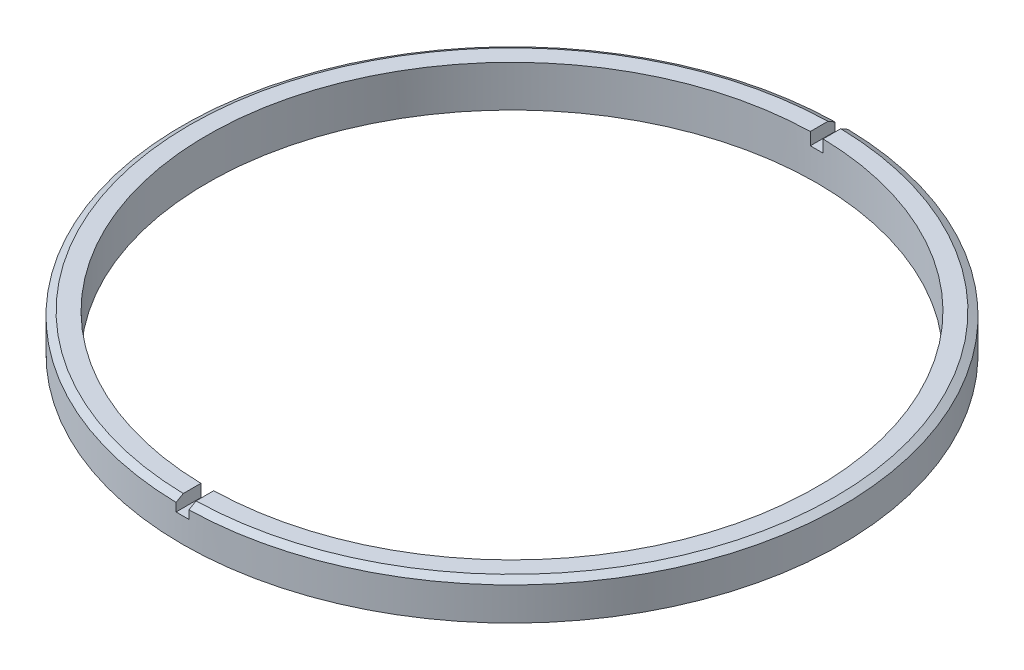
ISO-10303-21;
HEADER;
FILE_DESCRIPTION(('STEP AP214'),'2;1');
FILE_NAME('part.step','',(''),(''),'','','');
FILE_SCHEMA(('AUTOMOTIVE_DESIGN { 1 0 10303 214 1 1 1 1 }'));
ENDSEC;
DATA;
#1=APPLICATION_CONTEXT('core data for automotive mechanical design processes');
#2=APPLICATION_PROTOCOL_DEFINITION('international standard','automotive_design',2000,#1);
#3=PRODUCT_CONTEXT('',#1,'mechanical');
#4=PRODUCT('Part','Part','',(#3));
#5=PRODUCT_RELATED_PRODUCT_CATEGORY('part','',(#4));
#6=PRODUCT_DEFINITION_FORMATION('','',#4);
#7=PRODUCT_DEFINITION_CONTEXT('part definition',#1,'design');
#8=PRODUCT_DEFINITION('design','',#6,#7);
#9=PRODUCT_DEFINITION_SHAPE('','',#8);
#10=(LENGTH_UNIT() NAMED_UNIT(*) SI_UNIT(.MILLI.,.METRE.));
#11=(NAMED_UNIT(*) PLANE_ANGLE_UNIT() SI_UNIT($,.RADIAN.));
#12=(NAMED_UNIT(*) SI_UNIT($,.STERADIAN.) SOLID_ANGLE_UNIT());
#13=UNCERTAINTY_MEASURE_WITH_UNIT(LENGTH_MEASURE(1.E-05),#10,'distance_accuracy_value','');
#14=(GEOMETRIC_REPRESENTATION_CONTEXT(3) GLOBAL_UNCERTAINTY_ASSIGNED_CONTEXT((#13)) GLOBAL_UNIT_ASSIGNED_CONTEXT((#10,
#11,#12)) REPRESENTATION_CONTEXT('',''));
#15=CARTESIAN_POINT('',(0.,0.,0.));
#16=DIRECTION('',(0.,0.,1.));
#17=DIRECTION('',(1.,0.,0.));
#18=AXIS2_PLACEMENT_3D('',#15,#16,#17);
#19=CARTESIAN_POINT('',(0.,1.016,0.));
#20=DIRECTION('',(0.,-1.,0.));
#21=DIRECTION('',(0.,0.,-1.));
#22=AXIS2_PLACEMENT_3D('',#19,#20,#21);
#23=CONICAL_SURFACE('',#22,20.25,1.04719755119659);
#24=CARTESIAN_POINT('',(0.393700000000006,2.55381737891898,-17.582014814696));
#25=CARTESIAN_POINT('',(0.393700000000006,2.079299758821,-18.4041039172719));
#26=CARTESIAN_POINT('',(0.393700000000007,1.60477356976618,-19.2261880735266));
#27=CARTESIAN_POINT('',(0.393700000000007,0.655704053755512,-20.8703464933714));
#28=CARTESIAN_POINT('',(0.393700000000007,0.181160726799667,-21.6924207569616));
#29=CARTESIAN_POINT('',(0.393700000000007,-0.29339116911303,-22.5144900742305));
#30=B_SPLINE_CURVE_WITH_KNOTS('',3,(#24,#25,#26,#27,#28,#29),.UNSPECIFIED.,.F.,.F.,(4,2,4),(0.,
2.84762658657598,5.69525317307586),.UNSPECIFIED.);
#31=CARTESIAN_POINT('',(0.393700000000007,1.27,-19.8061465624321));
#32=VERTEX_POINT('',#31);
#33=CARTESIAN_POINT('',(0.393700000000007,1.016,-20.2461724854354));
#34=VERTEX_POINT('',#33);
#35=EDGE_CURVE('E128',#32,#34,#30,.T.);
#36=ORIENTED_EDGE('',*,*,#35,.F.);
#37=CARTESIAN_POINT('',(0.,1.27,0.));
#38=DIRECTION('',(0.,1.,0.));
#39=DIRECTION('',(0.,0.,1.));
#40=AXIS2_PLACEMENT_3D('',#37,#38,#39);
#41=CIRCLE('',#40,19.8100590948775);
#42=CARTESIAN_POINT('',(0.393700000000007,1.27,19.8061465624321));
#43=VERTEX_POINT('',#42);
#44=EDGE_CURVE('E10',#43,#32,#41,.T.);
#45=ORIENTED_EDGE('',*,*,#44,.F.);
#46=CARTESIAN_POINT('',(0.393700000000007,-0.128390531450435,22.2286563339852));
#47=CARTESIAN_POINT('',(0.393700000000007,0.346160065044203,21.4065862665888));
#48=CARTESIAN_POINT('',(0.393700000000007,0.820701711461422,20.5845110329041));
#49=CARTESIAN_POINT('',(0.393700000000006,1.76976710415505,18.9403502329336));
#50=CARTESIAN_POINT('',(0.393700000000006,2.24429085043146,18.1182646666479));
#51=CARTESIAN_POINT('',(0.393700000000006,2.71880564663046,17.2961739340739));
#52=B_SPLINE_CURVE_WITH_KNOTS('',3,(#46,#47,#48,#49,#50,#51),.UNSPECIFIED.,.F.,.F.,(4,2,4),(0.,
2.84762658651018,5.69525317310457),.UNSPECIFIED.);
#53=CARTESIAN_POINT('',(0.393700000000007,1.016,20.2461724854354));
#54=VERTEX_POINT('',#53);
#55=EDGE_CURVE('E161',#54,#43,#52,.T.);
#56=ORIENTED_EDGE('',*,*,#55,.F.);
#57=CARTESIAN_POINT('',(0.,1.016,0.));
#58=DIRECTION('',(0.,1.,0.));
#59=DIRECTION('',(0.,0.,1.));
#60=AXIS2_PLACEMENT_3D('',#57,#58,#59);
#61=CIRCLE('',#60,20.25);
#62=EDGE_CURVE('E169',#54,#34,#61,.T.);
#63=ORIENTED_EDGE('',*,*,#62,.T.);
#64=EDGE_LOOP('',(#36,#45,#56,#63));
#65=FACE_BOUND('',#64,.T.);
#66=ADVANCED_FACE('F16',(#65),#23,.T.);
#67=CARTESIAN_POINT('',(18.726,1.27,0.));
#68=DIRECTION('',(0.,-1.,0.));
#69=DIRECTION('',(0.,0.,-1.));
#70=AXIS2_PLACEMENT_3D('',#67,#68,#69);
#71=PLANE('',#70);
#72=DIRECTION('',(0.,0.,1.));
#73=VECTOR('',#72,1.);
#74=CARTESIAN_POINT('',(0.393700000000004,1.27,0.));
#75=LINE('',#74,#73);
#76=CARTESIAN_POINT('',(0.393700000000006,1.27,-18.7218609200581));
#77=VERTEX_POINT('',#76);
#78=EDGE_CURVE('E216',#32,#77,#75,.T.);
#79=ORIENTED_EDGE('',*,*,#78,.T.);
#80=CARTESIAN_POINT('',(0.,1.27,0.));
#81=DIRECTION('',(0.,1.,0.));
#82=DIRECTION('',(0.,0.,1.));
#83=AXIS2_PLACEMENT_3D('',#80,#81,#82);
#84=CIRCLE('',#83,18.726);
#85=CARTESIAN_POINT('',(0.393700000000006,1.27,18.7218609200581));
#86=VERTEX_POINT('',#85);
#87=EDGE_CURVE('E181',#86,#77,#84,.T.);
#88=ORIENTED_EDGE('',*,*,#87,.F.);
#89=DIRECTION('',(0.,0.,1.));
#90=VECTOR('',#89,1.);
#91=CARTESIAN_POINT('',(0.393700000000004,1.27,0.));
#92=LINE('',#91,#90);
#93=EDGE_CURVE('E203',#86,#43,#92,.T.);
#94=ORIENTED_EDGE('',*,*,#93,.T.);
#95=ORIENTED_EDGE('',*,*,#44,.T.);
#96=EDGE_LOOP('',(#79,#88,#94,#95));
#97=FACE_BOUND('',#96,.T.);
#98=ADVANCED_FACE('F224',(#97),#71,.F.);
#99=CARTESIAN_POINT('',(0.,1.27,0.));
#100=DIRECTION('',(0.,1.,0.));
#101=DIRECTION('',(0.,0.,1.));
#102=AXIS2_PLACEMENT_3D('',#99,#100,#101);
#103=CYLINDRICAL_SURFACE('',#102,18.726);
#104=CARTESIAN_POINT('',(0.,-1.27,0.));
#105=DIRECTION('',(0.,1.,0.));
#106=DIRECTION('',(0.,0.,1.));
#107=AXIS2_PLACEMENT_3D('',#104,#105,#106);
#108=CIRCLE('',#107,18.726);
#109=CARTESIAN_POINT('',(0.,-1.27,18.726));
#110=VERTEX_POINT('',#109);
#111=EDGE_CURVE('E178',#110,#110,#108,.T.);
#112=ORIENTED_EDGE('',*,*,#111,.F.);
#113=EDGE_LOOP('',(#112));
#114=FACE_BOUND('',#113,.T.);
#115=DIRECTION('',(0.,1.,0.));
#116=VECTOR('',#115,1.);
#117=CARTESIAN_POINT('',(0.393700000000006,0.508,-18.7218609200581));
#118=LINE('',#117,#116);
#119=CARTESIAN_POINT('',(0.393700000000006,0.508,-18.7218609200581));
#120=VERTEX_POINT('',#119);
#121=EDGE_CURVE('E117',#120,#77,#118,.T.);
#122=ORIENTED_EDGE('',*,*,#121,.F.);
#123=CARTESIAN_POINT('',(0.,0.508,0.));
#124=DIRECTION('',(0.,1.,0.));
#125=DIRECTION('',(0.,0.,1.));
#126=AXIS2_PLACEMENT_3D('',#123,#124,#125);
#127=CIRCLE('',#126,18.726);
#128=CARTESIAN_POINT('',(-0.393699999999994,0.508,-18.7218609200581));
#129=VERTEX_POINT('',#128);
#130=EDGE_CURVE('E103',#120,#129,#127,.T.);
#131=ORIENTED_EDGE('',*,*,#130,.T.);
#132=DIRECTION('',(0.,1.,0.));
#133=VECTOR('',#132,1.);
#134=CARTESIAN_POINT('',(-0.393699999999994,0.508,-18.7218609200581));
#135=LINE('',#134,#133);
#136=CARTESIAN_POINT('',(-0.393699999999994,1.27,-18.7218609200581));
#137=VERTEX_POINT('',#136);
#138=EDGE_CURVE('E101',#129,#137,#135,.T.);
#139=ORIENTED_EDGE('',*,*,#138,.T.);
#140=CARTESIAN_POINT('',(-0.393699999999994,1.27,18.7218609200581));
#141=VERTEX_POINT('',#140);
#142=EDGE_CURVE('E180',#137,#141,#84,.T.);
#143=ORIENTED_EDGE('',*,*,#142,.T.);
#144=DIRECTION('',(0.,1.,0.));
#145=VECTOR('',#144,1.);
#146=CARTESIAN_POINT('',(-0.393699999999994,0.508,18.7218609200581));
#147=LINE('',#146,#145);
#148=CARTESIAN_POINT('',(-0.393699999999994,0.508,18.7218609200581));
#149=VERTEX_POINT('',#148);
#150=EDGE_CURVE('E192',#149,#141,#147,.T.);
#151=ORIENTED_EDGE('',*,*,#150,.F.);
#152=CARTESIAN_POINT('',(0.,0.508,0.));
#153=DIRECTION('',(0.,1.,0.));
#154=DIRECTION('',(0.,0.,1.));
#155=AXIS2_PLACEMENT_3D('',#152,#153,#154);
#156=CIRCLE('',#155,18.726);
#157=CARTESIAN_POINT('',(0.393700000000006,0.508,18.7218609200581));
#158=VERTEX_POINT('',#157);
#159=EDGE_CURVE('E205',#149,#158,#156,.T.);
#160=ORIENTED_EDGE('',*,*,#159,.T.);
#161=DIRECTION('',(0.,1.,0.));
#162=VECTOR('',#161,1.);
#163=CARTESIAN_POINT('',(0.393700000000006,0.508,18.7218609200581));
#164=LINE('',#163,#162);
#165=EDGE_CURVE('E163',#158,#86,#164,.T.);
#166=ORIENTED_EDGE('',*,*,#165,.T.);
#167=ORIENTED_EDGE('',*,*,#87,.T.);
#168=EDGE_LOOP('',(#122,#131,#139,#143,#151,#160,#166,#167));
#169=FACE_BOUND('',#168,.T.);
#170=ADVANCED_FACE('F190',(#114,#169),#103,.F.);
#171=CARTESIAN_POINT('',(0.,1.27,0.));
#172=DIRECTION('',(0.,1.,0.));
#173=DIRECTION('',(0.,0.,1.));
#174=AXIS2_PLACEMENT_3D('',#171,#172,#173);
#175=CYLINDRICAL_SURFACE('',#174,20.25);
#176=CARTESIAN_POINT('',(0.,-1.016,0.));
#177=DIRECTION('',(0.,1.,0.));
#178=DIRECTION('',(0.,0.,1.));
#179=AXIS2_PLACEMENT_3D('',#176,#177,#178);
#180=CIRCLE('',#179,20.25);
#181=CARTESIAN_POINT('',(0.,-1.016,20.25));
#182=VERTEX_POINT('',#181);
#183=EDGE_CURVE('E172',#182,#182,#180,.T.);
#184=ORIENTED_EDGE('',*,*,#183,.T.);
#185=EDGE_LOOP('',(#184));
#186=FACE_BOUND('',#185,.T.);
#187=DIRECTION('',(0.,1.,0.));
#188=VECTOR('',#187,1.);
#189=CARTESIAN_POINT('',(0.393700000000007,0.508,-20.2461724854354));
#190=LINE('',#189,#188);
#191=CARTESIAN_POINT('',(0.393700000000007,0.508,-20.2461724854354));
#192=VERTEX_POINT('',#191);
#193=EDGE_CURVE('E115',#192,#34,#190,.T.);
#194=ORIENTED_EDGE('',*,*,#193,.T.);
#195=ORIENTED_EDGE('',*,*,#62,.F.);
#196=DIRECTION('',(0.,1.,0.));
#197=VECTOR('',#196,1.);
#198=CARTESIAN_POINT('',(0.393700000000007,0.508,20.2461724854354));
#199=LINE('',#198,#197);
#200=CARTESIAN_POINT('',(0.393700000000007,0.508,20.2461724854354));
#201=VERTEX_POINT('',#200);
#202=EDGE_CURVE('E162',#201,#54,#199,.T.);
#203=ORIENTED_EDGE('',*,*,#202,.F.);
#204=CARTESIAN_POINT('',(0.,0.508,0.));
#205=DIRECTION('',(0.,1.,0.));
#206=DIRECTION('',(0.,0.,1.));
#207=AXIS2_PLACEMENT_3D('',#204,#205,#206);
#208=CIRCLE('',#207,20.25);
#209=CARTESIAN_POINT('',(-0.393699999999994,0.508,20.2461724854354));
#210=VERTEX_POINT('',#209);
#211=EDGE_CURVE('E213',#210,#201,#208,.T.);
#212=ORIENTED_EDGE('',*,*,#211,.F.);
#213=DIRECTION('',(0.,1.,0.));
#214=VECTOR('',#213,1.);
#215=CARTESIAN_POINT('',(-0.393699999999994,0.508,20.2461724854354));
#216=LINE('',#215,#214);
#217=CARTESIAN_POINT('',(-0.393699999999994,1.016,20.2461724854354));
#218=VERTEX_POINT('',#217);
#219=EDGE_CURVE('E199',#210,#218,#216,.T.);
#220=ORIENTED_EDGE('',*,*,#219,.T.);
#221=CARTESIAN_POINT('',(-0.393699999999994,1.016,-20.2461724854354));
#222=VERTEX_POINT('',#221);
#223=EDGE_CURVE('E114',#222,#218,#61,.T.);
#224=ORIENTED_EDGE('',*,*,#223,.F.);
#225=DIRECTION('',(0.,1.,0.));
#226=VECTOR('',#225,1.);
#227=CARTESIAN_POINT('',(-0.393699999999994,0.508,-20.2461724854354));
#228=LINE('',#227,#226);
#229=CARTESIAN_POINT('',(-0.393699999999994,0.508,-20.2461724854354));
#230=VERTEX_POINT('',#229);
#231=EDGE_CURVE('E98',#230,#222,#228,.T.);
#232=ORIENTED_EDGE('',*,*,#231,.F.);
#233=CARTESIAN_POINT('',(0.,0.508,0.));
#234=DIRECTION('',(0.,1.,0.));
#235=DIRECTION('',(0.,0.,1.));
#236=AXIS2_PLACEMENT_3D('',#233,#234,#235);
#237=CIRCLE('',#236,20.25);
#238=EDGE_CURVE('E104',#192,#230,#237,.T.);
#239=ORIENTED_EDGE('',*,*,#238,.F.);
#240=EDGE_LOOP('',(#194,#195,#203,#212,#220,#224,#232,#239));
#241=FACE_BOUND('',#240,.T.);
#242=ADVANCED_FACE('F112',(#186,#241),#175,.T.);
#243=CARTESIAN_POINT('',(-0.393699999999994,1.27,-19.8061465624321));
#244=VERTEX_POINT('',#243);
#245=CARTESIAN_POINT('',(-0.393699999999994,1.27,19.8061465624321));
#246=VERTEX_POINT('',#245);
#247=EDGE_CURVE('E25',#244,#246,#41,.T.);
#248=ORIENTED_EDGE('',*,*,#247,.F.);
#249=CARTESIAN_POINT('',(-0.393699999999994,2.55381737891898,-17.582014814696));
#250=CARTESIAN_POINT('',(-0.393699999999994,2.079299758821,-18.4041039172719));
#251=CARTESIAN_POINT('',(-0.393699999999994,1.60477356976618,-19.2261880735266));
#252=CARTESIAN_POINT('',(-0.393699999999994,0.655704053755512,-20.8703464933714));
#253=CARTESIAN_POINT('',(-0.393699999999994,0.181160726799667,-21.6924207569616));
#254=CARTESIAN_POINT('',(-0.393699999999994,-0.29339116911303,-22.5144900742305));
#255=B_SPLINE_CURVE_WITH_KNOTS('',3,(#249,#250,#251,#252,#253,#254),.UNSPECIFIED.,.F.,.F.,(4,2,
4),(0.,2.84762658657598,5.69525317307586),.UNSPECIFIED.);
#256=EDGE_CURVE('E122',#244,#222,#255,.T.);
#257=ORIENTED_EDGE('',*,*,#256,.T.);
#258=ORIENTED_EDGE('',*,*,#223,.T.);
#259=CARTESIAN_POINT('',(-0.393699999999994,-0.128390531450435,22.2286563339852));
#260=CARTESIAN_POINT('',(-0.393699999999994,0.346160065044203,21.4065862665888));
#261=CARTESIAN_POINT('',(-0.393699999999994,0.820701711461422,20.5845110329041));
#262=CARTESIAN_POINT('',(-0.393699999999994,1.76976710415505,18.9403502329336));
#263=CARTESIAN_POINT('',(-0.393699999999994,2.24429085043146,18.1182646666479));
#264=CARTESIAN_POINT('',(-0.393699999999994,2.71880564663046,17.2961739340739));
#265=B_SPLINE_CURVE_WITH_KNOTS('',3,(#259,#260,#261,#262,#263,#264),.UNSPECIFIED.,.F.,.F.,(4,2,
4),(0.,2.84762658651018,5.69525317310457),.UNSPECIFIED.);
#266=EDGE_CURVE('E154',#218,#246,#265,.T.);
#267=ORIENTED_EDGE('',*,*,#266,.T.);
#268=EDGE_LOOP('',(#248,#257,#258,#267));
#269=FACE_BOUND('',#268,.T.);
#270=ADVANCED_FACE('F18',(#269),#23,.T.);
#271=ORIENTED_EDGE('',*,*,#142,.F.);
#272=DIRECTION('',(0.,0.,1.));
#273=VECTOR('',#272,1.);
#274=CARTESIAN_POINT('',(-0.393699999999997,1.27,0.));
#275=LINE('',#274,#273);
#276=EDGE_CURVE('E215',#244,#137,#275,.T.);
#277=ORIENTED_EDGE('',*,*,#276,.F.);
#278=ORIENTED_EDGE('',*,*,#247,.T.);
#279=DIRECTION('',(0.,0.,1.));
#280=VECTOR('',#279,1.);
#281=CARTESIAN_POINT('',(-0.393699999999997,1.27,0.));
#282=LINE('',#281,#280);
#283=EDGE_CURVE('E198',#141,#246,#282,.T.);
#284=ORIENTED_EDGE('',*,*,#283,.F.);
#285=EDGE_LOOP('',(#271,#277,#278,#284));
#286=FACE_BOUND('',#285,.T.);
#287=ADVANCED_FACE('F200',(#286),#71,.F.);
#288=CARTESIAN_POINT('',(19.8100590948775,-1.27,0.));
#289=DIRECTION('',(0.,1.,0.));
#290=DIRECTION('',(0.,0.,1.));
#291=AXIS2_PLACEMENT_3D('',#288,#289,#290);
#292=PLANE('',#291);
#293=CARTESIAN_POINT('',(0.,-1.27,0.));
#294=DIRECTION('',(0.,1.,0.));
#295=DIRECTION('',(0.,0.,1.));
#296=AXIS2_PLACEMENT_3D('',#293,#294,#295);
#297=CIRCLE('',#296,19.8100590948775);
#298=CARTESIAN_POINT('',(0.,-1.27,19.8100590948775));
#299=VERTEX_POINT('',#298);
#300=EDGE_CURVE('E175',#299,#299,#297,.T.);
#301=ORIENTED_EDGE('',*,*,#300,.F.);
#302=EDGE_LOOP('',(#301));
#303=FACE_BOUND('',#302,.T.);
#304=ORIENTED_EDGE('',*,*,#111,.T.);
#305=EDGE_LOOP('',(#304));
#306=FACE_BOUND('',#305,.T.);
#307=ADVANCED_FACE('F239',(#303,#306),#292,.F.);
#308=CARTESIAN_POINT('',(0.,-1.27,0.));
#309=DIRECTION('',(0.,1.,0.));
#310=DIRECTION('',(0.,0.,1.));
#311=AXIS2_PLACEMENT_3D('',#308,#309,#310);
#312=CONICAL_SURFACE('',#311,19.8100590948775,1.04719755119659);
#313=ORIENTED_EDGE('',*,*,#183,.F.);
#314=EDGE_LOOP('',(#313));
#315=FACE_BOUND('',#314,.T.);
#316=ORIENTED_EDGE('',*,*,#300,.T.);
#317=EDGE_LOOP('',(#316));
#318=FACE_BOUND('',#317,.T.);
#319=ADVANCED_FACE('F234',(#315,#318),#312,.T.);
#320=CARTESIAN_POINT('',(0.393700000000004,0.508,0.));
#321=DIRECTION('',(-1.,0.,0.));
#322=DIRECTION('',(0.,0.,1.));
#323=AXIS2_PLACEMENT_3D('',#320,#321,#322);
#324=PLANE('',#323);
#325=ORIENTED_EDGE('',*,*,#55,.T.);
#326=ORIENTED_EDGE('',*,*,#93,.F.);
#327=ORIENTED_EDGE('',*,*,#165,.F.);
#328=DIRECTION('',(0.,0.,1.));
#329=VECTOR('',#328,1.);
#330=CARTESIAN_POINT('',(0.393700000000004,0.508,0.));
#331=LINE('',#330,#329);
#332=EDGE_CURVE('E202',#158,#201,#331,.T.);
#333=ORIENTED_EDGE('',*,*,#332,.T.);
#334=ORIENTED_EDGE('',*,*,#202,.T.);
#335=EDGE_LOOP('',(#325,#326,#327,#333,#334));
#336=FACE_BOUND('',#335,.T.);
#337=ADVANCED_FACE('F149',(#336),#324,.T.);
#338=CARTESIAN_POINT('',(-0.393699999999997,0.508,0.));
#339=DIRECTION('',(-1.,0.,0.));
#340=DIRECTION('',(0.,0.,1.));
#341=AXIS2_PLACEMENT_3D('',#338,#339,#340);
#342=PLANE('',#341);
#343=ORIENTED_EDGE('',*,*,#219,.F.);
#344=DIRECTION('',(0.,0.,1.));
#345=VECTOR('',#344,1.);
#346=CARTESIAN_POINT('',(-0.393699999999997,0.508,0.));
#347=LINE('',#346,#345);
#348=EDGE_CURVE('E40',#149,#210,#347,.T.);
#349=ORIENTED_EDGE('',*,*,#348,.F.);
#350=ORIENTED_EDGE('',*,*,#150,.T.);
#351=ORIENTED_EDGE('',*,*,#283,.T.);
#352=ORIENTED_EDGE('',*,*,#266,.F.);
#353=EDGE_LOOP('',(#343,#349,#350,#351,#352));
#354=FACE_BOUND('',#353,.T.);
#355=ADVANCED_FACE('F145',(#354),#342,.F.);
#356=CARTESIAN_POINT('',(-43.7235513649678,0.508,0.));
#357=DIRECTION('',(0.,1.,0.));
#358=DIRECTION('',(0.,0.,1.));
#359=AXIS2_PLACEMENT_3D('',#356,#357,#358);
#360=PLANE('',#359);
#361=ORIENTED_EDGE('',*,*,#332,.F.);
#362=ORIENTED_EDGE('',*,*,#159,.F.);
#363=ORIENTED_EDGE('',*,*,#348,.T.);
#364=ORIENTED_EDGE('',*,*,#211,.T.);
#365=EDGE_LOOP('',(#361,#362,#363,#364));
#366=FACE_BOUND('',#365,.T.);
#367=ADVANCED_FACE('F141',(#366),#360,.T.);
#368=CARTESIAN_POINT('',(0.393700000000004,0.508,0.));
#369=DIRECTION('',(-1.,0.,0.));
#370=DIRECTION('',(0.,0.,1.));
#371=AXIS2_PLACEMENT_3D('',#368,#369,#370);
#372=PLANE('',#371);
#373=ORIENTED_EDGE('',*,*,#35,.T.);
#374=ORIENTED_EDGE('',*,*,#193,.F.);
#375=DIRECTION('',(0.,0.,1.));
#376=VECTOR('',#375,1.);
#377=CARTESIAN_POINT('',(0.393700000000004,0.508,0.));
#378=LINE('',#377,#376);
#379=EDGE_CURVE('E32',#192,#120,#378,.T.);
#380=ORIENTED_EDGE('',*,*,#379,.T.);
#381=ORIENTED_EDGE('',*,*,#121,.T.);
#382=ORIENTED_EDGE('',*,*,#78,.F.);
#383=EDGE_LOOP('',(#373,#374,#380,#381,#382));
#384=FACE_BOUND('',#383,.T.);
#385=ADVANCED_FACE('F137',(#384),#372,.T.);
#386=CARTESIAN_POINT('',(-0.393699999999997,0.508,0.));
#387=DIRECTION('',(-1.,0.,0.));
#388=DIRECTION('',(0.,0.,1.));
#389=AXIS2_PLACEMENT_3D('',#386,#387,#388);
#390=PLANE('',#389);
#391=ORIENTED_EDGE('',*,*,#276,.T.);
#392=ORIENTED_EDGE('',*,*,#138,.F.);
#393=DIRECTION('',(0.,0.,1.));
#394=VECTOR('',#393,1.);
#395=CARTESIAN_POINT('',(-0.393699999999997,0.508,0.));
#396=LINE('',#395,#394);
#397=EDGE_CURVE('E95',#230,#129,#396,.T.);
#398=ORIENTED_EDGE('',*,*,#397,.F.);
#399=ORIENTED_EDGE('',*,*,#231,.T.);
#400=ORIENTED_EDGE('',*,*,#256,.F.);
#401=EDGE_LOOP('',(#391,#392,#398,#399,#400));
#402=FACE_BOUND('',#401,.T.);
#403=ADVANCED_FACE('F96',(#402),#390,.F.);
#404=CARTESIAN_POINT('',(-43.7235513649678,0.508,0.));
#405=DIRECTION('',(0.,1.,0.));
#406=DIRECTION('',(0.,0.,1.));
#407=AXIS2_PLACEMENT_3D('',#404,#405,#406);
#408=PLANE('',#407);
#409=ORIENTED_EDGE('',*,*,#379,.F.);
#410=ORIENTED_EDGE('',*,*,#238,.T.);
#411=ORIENTED_EDGE('',*,*,#397,.T.);
#412=ORIENTED_EDGE('',*,*,#130,.F.);
#413=EDGE_LOOP('',(#409,#410,#411,#412));
#414=FACE_BOUND('',#413,.T.);
#415=ADVANCED_FACE('F107',(#414),#408,.T.);
#416=CLOSED_SHELL('',(#66,#98,#170,#242,#270,#287,#307,#319,#337,#355,#367,#385,#403,#415));
#417=MANIFOLD_SOLID_BREP('B1',#416);
#418=ADVANCED_BREP_SHAPE_REPRESENTATION('',(#18,#417),#14);
#419=SHAPE_DEFINITION_REPRESENTATION(#9,#418);
ENDSEC;
END-ISO-10303-21;
